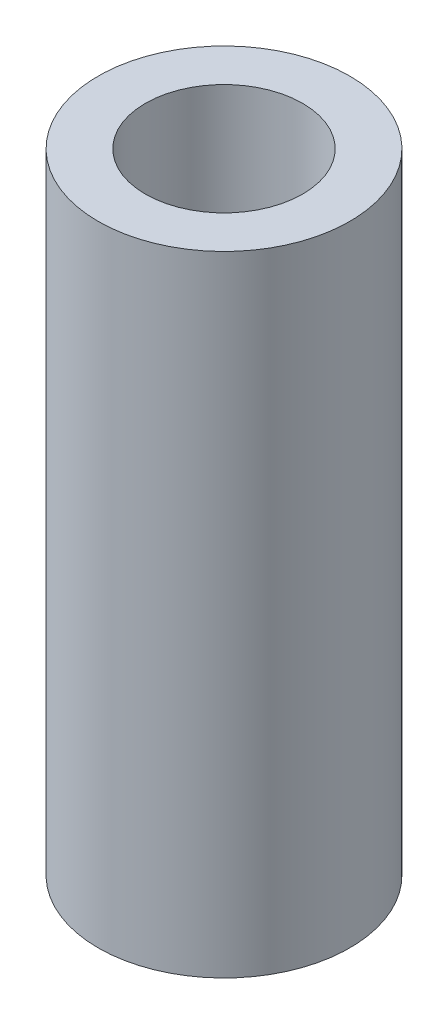
ISO-10303-21;
HEADER;
FILE_DESCRIPTION(('STEP AP214'),'2;1');
FILE_NAME('part.step','',(''),(''),'','','');
FILE_SCHEMA(('AUTOMOTIVE_DESIGN { 1 0 10303 214 1 1 1 1 }'));
ENDSEC;
DATA;
#1=APPLICATION_CONTEXT('core data for automotive mechanical design processes');
#2=APPLICATION_PROTOCOL_DEFINITION('international standard','automotive_design',2000,#1);
#3=PRODUCT_CONTEXT('',#1,'mechanical');
#4=PRODUCT('Part','Part','',(#3));
#5=PRODUCT_RELATED_PRODUCT_CATEGORY('part','',(#4));
#6=PRODUCT_DEFINITION_FORMATION('','',#4);
#7=PRODUCT_DEFINITION_CONTEXT('part definition',#1,'design');
#8=PRODUCT_DEFINITION('design','',#6,#7);
#9=PRODUCT_DEFINITION_SHAPE('','',#8);
#10=(LENGTH_UNIT() NAMED_UNIT(*) SI_UNIT(.MILLI.,.METRE.));
#11=(NAMED_UNIT(*) PLANE_ANGLE_UNIT() SI_UNIT($,.RADIAN.));
#12=(NAMED_UNIT(*) SI_UNIT($,.STERADIAN.) SOLID_ANGLE_UNIT());
#13=UNCERTAINTY_MEASURE_WITH_UNIT(LENGTH_MEASURE(1.E-05),#10,'distance_accuracy_value','');
#14=(GEOMETRIC_REPRESENTATION_CONTEXT(3) GLOBAL_UNCERTAINTY_ASSIGNED_CONTEXT((#13)) GLOBAL_UNIT_ASSIGNED_CONTEXT((#10,
#11,#12)) REPRESENTATION_CONTEXT('',''));
#15=CARTESIAN_POINT('',(0.,0.,0.));
#16=DIRECTION('',(0.,0.,1.));
#17=DIRECTION('',(1.,0.,0.));
#18=AXIS2_PLACEMENT_3D('',#15,#16,#17);
#19=CARTESIAN_POINT('',(0.,10.,0.));
#20=DIRECTION('',(0.,-1.,0.));
#21=DIRECTION('',(0.,0.,-1.));
#22=AXIS2_PLACEMENT_3D('',#19,#20,#21);
#23=CYLINDRICAL_SURFACE('',#22,2.);
#24=CARTESIAN_POINT('',(0.,10.,0.));
#25=DIRECTION('',(0.,1.,0.));
#26=DIRECTION('',(0.,0.,1.));
#27=AXIS2_PLACEMENT_3D('',#24,#25,#26);
#28=CIRCLE('',#27,2.);
#29=CARTESIAN_POINT('',(0.,10.,2.));
#30=VERTEX_POINT('',#29);
#31=EDGE_CURVE('E10',#30,#30,#28,.T.);
#32=ORIENTED_EDGE('',*,*,#31,.F.);
#33=EDGE_LOOP('',(#32));
#34=FACE_BOUND('',#33,.T.);
#35=CARTESIAN_POINT('',(0.,0.,0.));
#36=DIRECTION('',(0.,1.,0.));
#37=DIRECTION('',(0.,0.,1.));
#38=AXIS2_PLACEMENT_3D('',#35,#36,#37);
#39=CIRCLE('',#38,2.);
#40=CARTESIAN_POINT('',(0.,0.,2.));
#41=VERTEX_POINT('',#40);
#42=EDGE_CURVE('E34',#41,#41,#39,.T.);
#43=ORIENTED_EDGE('',*,*,#42,.T.);
#44=EDGE_LOOP('',(#43));
#45=FACE_BOUND('',#44,.T.);
#46=ADVANCED_FACE('F31',(#34,#45),#23,.T.);
#47=CARTESIAN_POINT('',(0.,10.,0.));
#48=DIRECTION('',(0.,1.,0.));
#49=DIRECTION('',(0.,0.,1.));
#50=AXIS2_PLACEMENT_3D('',#47,#48,#49);
#51=PLANE('',#50);
#52=CARTESIAN_POINT('',(0.,10.,0.));
#53=DIRECTION('',(0.,-1.,0.));
#54=DIRECTION('',(0.,0.,-1.));
#55=AXIS2_PLACEMENT_3D('',#52,#53,#54);
#56=CIRCLE('',#55,1.25);
#57=CARTESIAN_POINT('',(0.,10.,-1.25));
#58=VERTEX_POINT('',#57);
#59=EDGE_CURVE('E41',#58,#58,#56,.T.);
#60=ORIENTED_EDGE('',*,*,#59,.T.);
#61=EDGE_LOOP('',(#60));
#62=FACE_BOUND('',#61,.T.);
#63=ORIENTED_EDGE('',*,*,#31,.T.);
#64=EDGE_LOOP('',(#63));
#65=FACE_BOUND('',#64,.T.);
#66=ADVANCED_FACE('F49',(#62,#65),#51,.T.);
#67=CARTESIAN_POINT('',(0.,0.,0.));
#68=DIRECTION('',(0.,1.,0.));
#69=DIRECTION('',(0.,0.,1.));
#70=AXIS2_PLACEMENT_3D('',#67,#68,#69);
#71=PLANE('',#70);
#72=CARTESIAN_POINT('',(0.,0.,0.));
#73=DIRECTION('',(0.,-1.,0.));
#74=DIRECTION('',(0.,0.,-1.));
#75=AXIS2_PLACEMENT_3D('',#72,#73,#74);
#76=CIRCLE('',#75,1.25);
#77=CARTESIAN_POINT('',(0.,0.,-1.25));
#78=VERTEX_POINT('',#77);
#79=EDGE_CURVE('E43',#78,#78,#76,.T.);
#80=ORIENTED_EDGE('',*,*,#79,.F.);
#81=EDGE_LOOP('',(#80));
#82=FACE_BOUND('',#81,.T.);
#83=ORIENTED_EDGE('',*,*,#42,.F.);
#84=EDGE_LOOP('',(#83));
#85=FACE_BOUND('',#84,.T.);
#86=ADVANCED_FACE('F54',(#82,#85),#71,.F.);
#87=CARTESIAN_POINT('',(0.,10.,0.));
#88=DIRECTION('',(0.,-1.,0.));
#89=DIRECTION('',(0.,0.,-1.));
#90=AXIS2_PLACEMENT_3D('',#87,#88,#89);
#91=CYLINDRICAL_SURFACE('',#90,1.25);
#92=ORIENTED_EDGE('',*,*,#59,.F.);
#93=EDGE_LOOP('',(#92));
#94=FACE_BOUND('',#93,.T.);
#95=ORIENTED_EDGE('',*,*,#79,.T.);
#96=EDGE_LOOP('',(#95));
#97=FACE_BOUND('',#96,.T.);
#98=ADVANCED_FACE('F51',(#94,#97),#91,.F.);
#99=CLOSED_SHELL('',(#46,#66,#86,#98));
#100=MANIFOLD_SOLID_BREP('B2',#99);
#101=ADVANCED_BREP_SHAPE_REPRESENTATION('',(#18,#100),#14);
#102=SHAPE_DEFINITION_REPRESENTATION(#9,#101);
ENDSEC;
END-ISO-10303-21;
